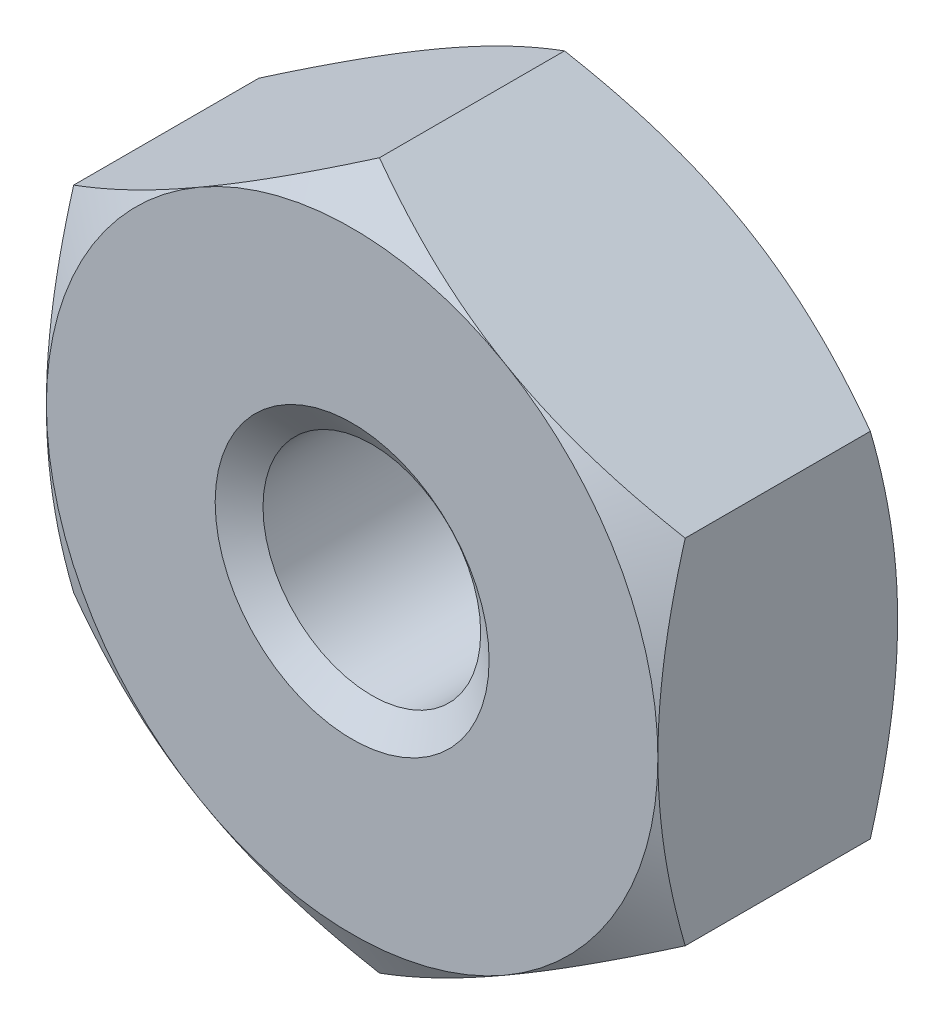
ISO-10303-21;
HEADER;
FILE_DESCRIPTION(('STEP AP214'),'2;1');
FILE_NAME('part.step','',(''),(''),'','','');
FILE_SCHEMA(('AUTOMOTIVE_DESIGN { 1 0 10303 214 1 1 1 1 }'));
ENDSEC;
DATA;
#1=APPLICATION_CONTEXT('core data for automotive mechanical design processes');
#2=APPLICATION_PROTOCOL_DEFINITION('international standard','automotive_design',2000,#1);
#3=PRODUCT_CONTEXT('',#1,'mechanical');
#4=PRODUCT('Part','Part','',(#3));
#5=PRODUCT_RELATED_PRODUCT_CATEGORY('part','',(#4));
#6=PRODUCT_DEFINITION_FORMATION('','',#4);
#7=PRODUCT_DEFINITION_CONTEXT('part definition',#1,'design');
#8=PRODUCT_DEFINITION('design','',#6,#7);
#9=PRODUCT_DEFINITION_SHAPE('','',#8);
#10=(LENGTH_UNIT() NAMED_UNIT(*) SI_UNIT(.MILLI.,.METRE.));
#11=(NAMED_UNIT(*) PLANE_ANGLE_UNIT() SI_UNIT($,.RADIAN.));
#12=(NAMED_UNIT(*) SI_UNIT($,.STERADIAN.) SOLID_ANGLE_UNIT());
#13=UNCERTAINTY_MEASURE_WITH_UNIT(LENGTH_MEASURE(1.E-05),#10,'distance_accuracy_value','');
#14=(GEOMETRIC_REPRESENTATION_CONTEXT(3) GLOBAL_UNCERTAINTY_ASSIGNED_CONTEXT((#13)) GLOBAL_UNIT_ASSIGNED_CONTEXT((#10,
#11,#12)) REPRESENTATION_CONTEXT('',''));
#15=CARTESIAN_POINT('',(0.,0.,0.));
#16=DIRECTION('',(0.,0.,1.));
#17=DIRECTION('',(1.,0.,0.));
#18=AXIS2_PLACEMENT_3D('',#15,#16,#17);
#19=CARTESIAN_POINT('',(0.,0.,-2.4892));
#20=DIRECTION('',(0.,0.,1.));
#21=DIRECTION('',(1.,0.,0.));
#22=AXIS2_PLACEMENT_3D('',#19,#20,#21);
#23=CYLINDRICAL_SURFACE('',#22,1.1303);
#24=CARTESIAN_POINT('',(0.,0.,-0.204530621911055));
#25=DIRECTION('',(0.,0.,1.));
#26=DIRECTION('',(1.,0.,0.));
#27=AXIS2_PLACEMENT_3D('',#24,#25,#26);
#28=CIRCLE('',#27,1.1303);
#29=CARTESIAN_POINT('',(1.1303,0.,-0.204530621911055));
#30=VERTEX_POINT('',#29);
#31=EDGE_CURVE('E176',#30,#30,#28,.F.);
#32=ORIENTED_EDGE('',*,*,#31,.F.);
#33=EDGE_LOOP('',(#32));
#34=FACE_BOUND('',#33,.T.);
#35=CARTESIAN_POINT('',(0.,0.,-2.25926937808894));
#36=DIRECTION('',(0.,0.,-1.));
#37=DIRECTION('',(-1.,0.,0.));
#38=AXIS2_PLACEMENT_3D('',#35,#36,#37);
#39=CIRCLE('',#38,1.1303);
#40=CARTESIAN_POINT('',(-1.1303,0.,-2.25926937808894));
#41=VERTEX_POINT('',#40);
#42=EDGE_CURVE('E41',#41,#41,#39,.F.);
#43=ORIENTED_EDGE('',*,*,#42,.F.);
#44=EDGE_LOOP('',(#43));
#45=FACE_BOUND('',#44,.T.);
#46=ADVANCED_FACE('F36',(#34,#45),#23,.F.);
#47=CARTESIAN_POINT('',(0.,3.66617420935413,-2.4892));
#48=DIRECTION('',(0.,0.,-1.));
#49=DIRECTION('',(-1.,0.,0.));
#50=AXIS2_PLACEMENT_3D('',#47,#48,#49);
#51=PLANE('',#50);
#52=CARTESIAN_POINT('',(0.,0.,-2.4892));
#53=DIRECTION('',(0.,0.,-1.));
#54=DIRECTION('',(-1.,0.,0.));
#55=AXIS2_PLACEMENT_3D('',#52,#53,#54);
#56=CIRCLE('',#55,3.175);
#57=CARTESIAN_POINT('',(-3.175,0.,-2.4892));
#58=VERTEX_POINT('',#57);
#59=CARTESIAN_POINT('',(-1.5875,-2.74963065701559,-2.4892));
#60=VERTEX_POINT('',#59);
#61=EDGE_CURVE('E172',#58,#60,#56,.F.);
#62=ORIENTED_EDGE('',*,*,#61,.F.);
#63=CARTESIAN_POINT('',(-1.58750000000001,2.74963065701559,-2.4892));
#64=VERTEX_POINT('',#63);
#65=EDGE_CURVE('E154',#64,#58,#56,.F.);
#66=ORIENTED_EDGE('',*,*,#65,.F.);
#67=CARTESIAN_POINT('',(1.5875,2.74963065701559,-2.4892));
#68=VERTEX_POINT('',#67);
#69=EDGE_CURVE('E171',#68,#64,#56,.F.);
#70=ORIENTED_EDGE('',*,*,#69,.F.);
#71=CARTESIAN_POINT('',(0.,0.,-2.4892));
#72=DIRECTION('',(0.,0.,1.));
#73=DIRECTION('',(1.,0.,0.));
#74=AXIS2_PLACEMENT_3D('',#71,#72,#73);
#75=CIRCLE('',#74,3.175);
#76=CARTESIAN_POINT('',(3.175,0.,-2.4892));
#77=VERTEX_POINT('',#76);
#78=EDGE_CURVE('E246',#77,#68,#75,.T.);
#79=ORIENTED_EDGE('',*,*,#78,.F.);
#80=CARTESIAN_POINT('',(1.58750000000001,-2.74963065701559,-2.4892));
#81=VERTEX_POINT('',#80);
#82=EDGE_CURVE('E378',#81,#77,#56,.F.);
#83=ORIENTED_EDGE('',*,*,#82,.F.);
#84=EDGE_CURVE('E399',#60,#81,#56,.F.);
#85=ORIENTED_EDGE('',*,*,#84,.F.);
#86=EDGE_LOOP('',(#62,#66,#70,#79,#83,#85));
#87=FACE_BOUND('',#86,.T.);
#88=CARTESIAN_POINT('',(0.,0.,-2.4892));
#89=DIRECTION('',(0.,0.,-1.));
#90=DIRECTION('',(-1.,0.,0.));
#91=AXIS2_PLACEMENT_3D('',#88,#89,#90);
#92=CIRCLE('',#91,1.4224);
#93=CARTESIAN_POINT('',(-1.4224,0.,-2.4892));
#94=VERTEX_POINT('',#93);
#95=EDGE_CURVE('E179',#94,#94,#92,.F.);
#96=ORIENTED_EDGE('',*,*,#95,.T.);
#97=EDGE_LOOP('',(#96));
#98=FACE_BOUND('',#97,.T.);
#99=ADVANCED_FACE('F251',(#87,#98),#51,.T.);
#100=CARTESIAN_POINT('',(0.,3.66617420935413,0.));
#101=DIRECTION('',(0.,0.,-1.));
#102=DIRECTION('',(-1.,0.,0.));
#103=AXIS2_PLACEMENT_3D('',#100,#101,#102);
#104=PLANE('',#103);
#105=CARTESIAN_POINT('',(0.,0.,0.));
#106=DIRECTION('',(0.,0.,-1.));
#107=DIRECTION('',(-1.,0.,0.));
#108=AXIS2_PLACEMENT_3D('',#105,#106,#107);
#109=CIRCLE('',#108,3.175);
#110=CARTESIAN_POINT('',(-3.175,0.,0.));
#111=VERTEX_POINT('',#110);
#112=CARTESIAN_POINT('',(-1.58750000000001,2.74963065701559,0.));
#113=VERTEX_POINT('',#112);
#114=EDGE_CURVE('E11',#111,#113,#109,.T.);
#115=ORIENTED_EDGE('',*,*,#114,.F.);
#116=CARTESIAN_POINT('',(-1.5875,-2.74963065701559,0.));
#117=VERTEX_POINT('',#116);
#118=EDGE_CURVE('E48',#117,#111,#109,.T.);
#119=ORIENTED_EDGE('',*,*,#118,.F.);
#120=CARTESIAN_POINT('',(1.58750000000001,-2.74963065701559,0.));
#121=VERTEX_POINT('',#120);
#122=EDGE_CURVE('E175',#121,#117,#109,.T.);
#123=ORIENTED_EDGE('',*,*,#122,.F.);
#124=CARTESIAN_POINT('',(3.175,0.,0.));
#125=VERTEX_POINT('',#124);
#126=EDGE_CURVE('E344',#125,#121,#109,.T.);
#127=ORIENTED_EDGE('',*,*,#126,.F.);
#128=CARTESIAN_POINT('',(0.,0.,0.));
#129=DIRECTION('',(0.,0.,1.));
#130=DIRECTION('',(1.,0.,0.));
#131=AXIS2_PLACEMENT_3D('',#128,#129,#130);
#132=CIRCLE('',#131,3.175);
#133=CARTESIAN_POINT('',(1.5875,2.74963065701559,0.));
#134=VERTEX_POINT('',#133);
#135=EDGE_CURVE('E130',#125,#134,#132,.T.);
#136=ORIENTED_EDGE('',*,*,#135,.T.);
#137=EDGE_CURVE('E46',#113,#134,#109,.T.);
#138=ORIENTED_EDGE('',*,*,#137,.F.);
#139=EDGE_LOOP('',(#115,#119,#123,#127,#136,#138));
#140=FACE_BOUND('',#139,.T.);
#141=CARTESIAN_POINT('',(0.,0.,0.));
#142=DIRECTION('',(0.,0.,1.));
#143=DIRECTION('',(1.,0.,0.));
#144=AXIS2_PLACEMENT_3D('',#141,#142,#143);
#145=CIRCLE('',#144,1.4224);
#146=CARTESIAN_POINT('',(1.4224,0.,0.));
#147=VERTEX_POINT('',#146);
#148=EDGE_CURVE('E178',#147,#147,#145,.T.);
#149=ORIENTED_EDGE('',*,*,#148,.F.);
#150=EDGE_LOOP('',(#149));
#151=FACE_BOUND('',#150,.T.);
#152=ADVANCED_FACE('F303',(#140,#151),#104,.F.);
#153=CARTESIAN_POINT('',(0.,3.66617420935413,-2.4892));
#154=DIRECTION('',(-0.500000000000003,0.866025403784437,0.));
#155=DIRECTION('',(-0.866025403784437,-0.500000000000003,0.));
#156=AXIS2_PLACEMENT_3D('',#153,#154,#155);
#157=PLANE('',#156);
#158=DIRECTION('',(0.,0.,1.));
#159=VECTOR('',#158,1.);
#160=CARTESIAN_POINT('',(-3.175,1.83308710467705,-2.4892));
#161=LINE('',#160,#159);
#162=CARTESIAN_POINT('',(-3.175,1.83308710467707,-2.20562043801039));
#163=VERTEX_POINT('',#162);
#164=CARTESIAN_POINT('',(-3.175,1.83308710467705,-0.283579561989604));
#165=VERTEX_POINT('',#164);
#166=EDGE_CURVE('E166',#163,#165,#161,.T.);
#167=ORIENTED_EDGE('',*,*,#166,.T.);
#168=CARTESIAN_POINT('',(-3.1752,1.83297163462322,-0.283646231805777));
#169=CARTESIAN_POINT('',(-3.03567460326018,1.91352665998974,-0.237119934023206));
#170=CARTESIAN_POINT('',(-2.89494483272887,1.99477703088899,-0.194805864908322));
#171=CARTESIAN_POINT('',(-2.61104837470026,2.15868472735379,-0.120946008708286));
#172=CARTESIAN_POINT('',(-2.46787664251628,2.24134496547055,-0.0894263509090417));
#173=CARTESIAN_POINT('',(-2.18330753500984,2.40564101629245,-0.0403611049832706));
#174=CARTESIAN_POINT('',(-2.0419539457708,2.48725154909053,-0.0224889669031259));
#175=CARTESIAN_POINT('',(-1.7585816022433,2.65085664790703,-0.00115281403229668));
#176=CARTESIAN_POINT('',(-1.61656387803407,2.73285061920892,0.00232886836810178));
#177=CARTESIAN_POINT('',(-1.35119263453263,2.88606277807967,-0.0049117007222132));
#178=CARTESIAN_POINT('',(-1.22779940341379,2.95730389328231,-0.0138561461436312));
#179=CARTESIAN_POINT('',(-0.981816852669884,3.09932198517026,-0.0422055763684448));
#180=CARTESIAN_POINT('',(-0.859228383940738,3.17009847059057,-0.0616202467099072));
#181=CARTESIAN_POINT('',(-0.612738605574498,3.31240941048281,-0.110155730811224));
#182=CARTESIAN_POINT('',(-0.488868495421443,3.38392585192423,-0.139482298472807));
#183=CARTESIAN_POINT('',(-0.242975839646996,3.52589204292736,-0.206042193662161));
#184=CARTESIAN_POINT('',(-0.120950143425915,3.59634361148865,-0.243259880449917));
#185=CARTESIAN_POINT('',(0.000199999999997795,3.66628967940797,-0.283646231805782));
#186=B_SPLINE_CURVE_WITH_KNOTS('',3,(#168,#169,#170,#171,#172,#173,#174,#175,#176,#177,#178,
#179,#180,#181,#182,#183,#184,#185),.UNSPECIFIED.,.F.,.F.,(4,2,2,2,2,2,2,2,4),(0.,
0.503278731073368,1.00776724301492,1.49976968502821,1.99116790059651,2.41904879402149,
2.84732618162394,3.28510386250598,3.72202181665389),.UNSPECIFIED.);
#187=EDGE_CURVE('E135',#165,#113,#186,.T.);
#188=ORIENTED_EDGE('',*,*,#187,.T.);
#189=CARTESIAN_POINT('',(0.,3.66617420935413,-0.283579561989608));
#190=VERTEX_POINT('',#189);
#191=EDGE_CURVE('E55',#113,#190,#186,.T.);
#192=ORIENTED_EDGE('',*,*,#191,.T.);
#193=DIRECTION('',(0.,0.,1.));
#194=VECTOR('',#193,1.);
#195=CARTESIAN_POINT('',(0.,3.66617420935413,-2.4892));
#196=LINE('',#195,#194);
#197=CARTESIAN_POINT('',(0.,3.66617420935413,-2.20562043801039));
#198=VERTEX_POINT('',#197);
#199=EDGE_CURVE('E151',#198,#190,#196,.T.);
#200=ORIENTED_EDGE('',*,*,#199,.F.);
#201=CARTESIAN_POINT('',(-3.1752,1.83297163462322,-2.20555376819422));
#202=CARTESIAN_POINT('',(-3.03567460326018,1.91352665998974,-2.25208006597679));
#203=CARTESIAN_POINT('',(-2.89494483272887,1.99477703088899,-2.29439413509168));
#204=CARTESIAN_POINT('',(-2.61104837470026,2.15868472735379,-2.36825399129171));
#205=CARTESIAN_POINT('',(-2.46787664251628,2.24134496547055,-2.39977364909096));
#206=CARTESIAN_POINT('',(-2.18330753500984,2.40564101629245,-2.44883889501673));
#207=CARTESIAN_POINT('',(-2.0419539457708,2.48725154909053,-2.46671103309687));
#208=CARTESIAN_POINT('',(-1.7585816022433,2.65085664790703,-2.4880471859677));
#209=CARTESIAN_POINT('',(-1.61656387803408,2.73285061920892,-2.4915288683681));
#210=CARTESIAN_POINT('',(-1.35119263453263,2.88606277807967,-2.48428829927779));
#211=CARTESIAN_POINT('',(-1.22779940341379,2.95730389328231,-2.47534385385637));
#212=CARTESIAN_POINT('',(-0.981816852669885,3.09932198517026,-2.44699442363156));
#213=CARTESIAN_POINT('',(-0.859228383940739,3.17009847059057,-2.42757975329009));
#214=CARTESIAN_POINT('',(-0.612738605574499,3.31240941048281,-2.37904426918878));
#215=CARTESIAN_POINT('',(-0.488868495421443,3.38392585192423,-2.34971770152719));
#216=CARTESIAN_POINT('',(-0.242975839646997,3.52589204292736,-2.28315780633784));
#217=CARTESIAN_POINT('',(-0.120950143425915,3.59634361148865,-2.24594011955008));
#218=CARTESIAN_POINT('',(0.000199999999997508,3.66628967940797,-2.20555376819422));
#219=B_SPLINE_CURVE_WITH_KNOTS('',3,(#201,#202,#203,#204,#205,#206,#207,#208,#209,#210,#211,
#212,#213,#214,#215,#216,#217,#218),.UNSPECIFIED.,.F.,.F.,(4,2,2,2,2,2,2,2,4),(0.,
0.503278731073368,1.00776724301492,1.49976968502821,1.99116790059651,2.41904879402149,
2.84732618162394,3.28510386250597,3.72202181665389),.UNSPECIFIED.);
#220=EDGE_CURVE('E169',#64,#198,#219,.T.);
#221=ORIENTED_EDGE('',*,*,#220,.F.);
#222=EDGE_CURVE('E261',#163,#64,#219,.T.);
#223=ORIENTED_EDGE('',*,*,#222,.F.);
#224=EDGE_LOOP('',(#167,#188,#192,#200,#221,#223));
#225=FACE_BOUND('',#224,.T.);
#226=ADVANCED_FACE('F38',(#225),#157,.T.);
#227=CARTESIAN_POINT('',(3.175,1.83308710467706,-2.4892));
#228=DIRECTION('',(0.500000000000001,0.866025403784438,0.));
#229=DIRECTION('',(-0.866025403784438,0.500000000000001,0.));
#230=AXIS2_PLACEMENT_3D('',#227,#228,#229);
#231=PLANE('',#230);
#232=ORIENTED_EDGE('',*,*,#199,.T.);
#233=CARTESIAN_POINT('',(-0.000200000000002592,3.66628967940797,-0.283646231805782));
#234=CARTESIAN_POINT('',(0.139325396739816,3.58573465404144,-0.237119934023211));
#235=CARTESIAN_POINT('',(0.280055167271126,3.5044842831422,-0.194805864908326));
#236=CARTESIAN_POINT('',(0.56395162529974,3.34057658667739,-0.120946008708289));
#237=CARTESIAN_POINT('',(0.707123357483716,3.25791634856063,-0.0894263509090447));
#238=CARTESIAN_POINT('',(0.991692464990165,3.09362029773873,-0.0403611049832727));
#239=CARTESIAN_POINT('',(1.1330460542292,3.01200976494065,-0.0224889669031276));
#240=CARTESIAN_POINT('',(1.41641839775671,2.84840466612415,-0.00115281403229755));
#241=CARTESIAN_POINT('',(1.55843612196593,2.76641069482226,0.00232886836810127));
#242=CARTESIAN_POINT('',(1.82380736546737,2.61319853595151,-0.00491170072221298));
#243=CARTESIAN_POINT('',(1.94720059658621,2.54195742074887,-0.0138561461436305));
#244=CARTESIAN_POINT('',(2.19318314733012,2.39993932886093,-0.0422055763684434));
#245=CARTESIAN_POINT('',(2.31577161605926,2.32916284344061,-0.0616202467099056));
#246=CARTESIAN_POINT('',(2.5622613944255,2.18685190354837,-0.110155730811222));
#247=CARTESIAN_POINT('',(2.68613150457856,2.11533546210696,-0.139482298472804));
#248=CARTESIAN_POINT('',(2.932024160353,1.97336927110383,-0.206042193662157));
#249=CARTESIAN_POINT('',(3.05404985657409,1.90291770254253,-0.243259880449913));
#250=CARTESIAN_POINT('',(3.1752,1.83297163462322,-0.283646231805778));
#251=B_SPLINE_CURVE_WITH_KNOTS('',3,(#233,#234,#235,#236,#237,#238,#239,#240,#241,#242,#243,
#244,#245,#246,#247,#248,#249,#250),.UNSPECIFIED.,.F.,.F.,(4,2,2,2,2,2,2,2,4),(0.,
0.503278731073369,1.00776724301492,1.49976968502821,1.99116790059651,2.41904879402149,
2.84732618162394,3.28510386250598,3.72202181665389),.UNSPECIFIED.);
#252=EDGE_CURVE('E145',#190,#134,#251,.T.);
#253=ORIENTED_EDGE('',*,*,#252,.T.);
#254=CARTESIAN_POINT('',(3.175,1.83308710467707,-0.283579561989608));
#255=VERTEX_POINT('',#254);
#256=EDGE_CURVE('E62',#134,#255,#251,.T.);
#257=ORIENTED_EDGE('',*,*,#256,.T.);
#258=DIRECTION('',(0.,0.,1.));
#259=VECTOR('',#258,1.);
#260=CARTESIAN_POINT('',(3.175,1.83308710467706,-2.4892));
#261=LINE('',#260,#259);
#262=CARTESIAN_POINT('',(3.175,1.83308710467707,-2.20562043801039));
#263=VERTEX_POINT('',#262);
#264=EDGE_CURVE('E144',#263,#255,#261,.T.);
#265=ORIENTED_EDGE('',*,*,#264,.F.);
#266=CARTESIAN_POINT('',(-0.000200000000002578,3.66628967940797,-2.20555376819422));
#267=CARTESIAN_POINT('',(0.139325396739816,3.58573465404144,-2.25208006597679));
#268=CARTESIAN_POINT('',(0.280055167271126,3.5044842831422,-2.29439413509167));
#269=CARTESIAN_POINT('',(0.56395162529974,3.34057658667739,-2.36825399129171));
#270=CARTESIAN_POINT('',(0.707123357483716,3.25791634856063,-2.39977364909096));
#271=CARTESIAN_POINT('',(0.991692464990165,3.09362029773873,-2.44883889501673));
#272=CARTESIAN_POINT('',(1.1330460542292,3.01200976494066,-2.46671103309687));
#273=CARTESIAN_POINT('',(1.4164183977567,2.84840466612415,-2.4880471859677));
#274=CARTESIAN_POINT('',(1.55843612196593,2.76641069482226,-2.4915288683681));
#275=CARTESIAN_POINT('',(1.82380736546737,2.61319853595151,-2.48428829927779));
#276=CARTESIAN_POINT('',(1.94720059658621,2.54195742074887,-2.47534385385637));
#277=CARTESIAN_POINT('',(2.19318314733012,2.39993932886093,-2.44699442363156));
#278=CARTESIAN_POINT('',(2.31577161605926,2.32916284344061,-2.42757975329009));
#279=CARTESIAN_POINT('',(2.5622613944255,2.18685190354837,-2.37904426918878));
#280=CARTESIAN_POINT('',(2.68613150457856,2.11533546210696,-2.3497177015272));
#281=CARTESIAN_POINT('',(2.932024160353,1.97336927110383,-2.28315780633784));
#282=CARTESIAN_POINT('',(3.05404985657409,1.90291770254253,-2.24594011955009));
#283=CARTESIAN_POINT('',(3.1752,1.83297163462322,-2.20555376819422));
#284=B_SPLINE_CURVE_WITH_KNOTS('',3,(#266,#267,#268,#269,#270,#271,#272,#273,#274,#275,#276,
#277,#278,#279,#280,#281,#282,#283),.UNSPECIFIED.,.F.,.F.,(4,2,2,2,2,2,2,2,4),(0.,
0.503278731073369,1.00776724301492,1.49976968502821,1.99116790059651,2.41904879402149,
2.84732618162394,3.28510386250597,3.72202181665389),.UNSPECIFIED.);
#285=EDGE_CURVE('E255',#68,#263,#284,.T.);
#286=ORIENTED_EDGE('',*,*,#285,.F.);
#287=EDGE_CURVE('E260',#198,#68,#284,.T.);
#288=ORIENTED_EDGE('',*,*,#287,.F.);
#289=EDGE_LOOP('',(#232,#253,#257,#265,#286,#288));
#290=FACE_BOUND('',#289,.T.);
#291=ADVANCED_FACE('F142',(#290),#231,.T.);
#292=CARTESIAN_POINT('',(3.175,1.83308710467706,-2.4892));
#293=DIRECTION('',(-1.,0.,0.));
#294=DIRECTION('',(0.,0.,1.));
#295=AXIS2_PLACEMENT_3D('',#292,#293,#294);
#296=PLANE('',#295);
#297=CARTESIAN_POINT('',(3.175,-4.8616171420299,-1.51932228935976));
#298=CARTESIAN_POINT('',(3.175,-4.72221668774449,-1.45195628992123));
#299=CARTESIAN_POINT('',(3.175,-4.58248664475634,-1.38525996427212));
#300=CARTESIAN_POINT('',(3.175,-4.30218917292502,-1.25358933527025));
#301=CARTESIAN_POINT('',(3.175,-4.16162160419068,-1.18861533006649));
#302=CARTESIAN_POINT('',(3.175,-3.87871153776028,-1.06042973005273));
#303=CARTESIAN_POINT('',(3.175,-3.73636348618431,-0.997230348581289));
#304=CARTESIAN_POINT('',(3.175,-3.4504974070564,-0.873546152177363));
#305=CARTESIAN_POINT('',(3.175,-3.30697944095183,-0.813061195746994));
#306=CARTESIAN_POINT('',(3.175,-3.01676360978826,-0.694809578750527));
#307=CARTESIAN_POINT('',(3.175,-2.87004833678074,-0.637085406846329));
#308=CARTESIAN_POINT('',(3.175,-2.57488727143506,-0.52615800832404));
#309=CARTESIAN_POINT('',(3.175,-2.42644128864792,-0.472955284693414));
#310=CARTESIAN_POINT('',(3.175,-2.12788752613931,-0.372500325317013));
#311=CARTESIAN_POINT('',(3.175,-1.97778404697074,-0.325235438859671));
#312=CARTESIAN_POINT('',(3.175,-1.67544317117207,-0.238191164257202));
#313=CARTESIAN_POINT('',(3.175,-1.52320646578688,-0.198409408930922));
#314=CARTESIAN_POINT('',(3.175,-1.21649515954196,-0.12826269349477));
#315=CARTESIAN_POINT('',(3.175,-1.06201997425122,-0.0979002407280034));
#316=CARTESIAN_POINT('',(3.175,-0.751207163661342,-0.0486364247633595));
#317=CARTESIAN_POINT('',(3.175,-0.594869536715698,-0.0297350716985354));
#318=CARTESIAN_POINT('',(3.175,-0.282140016767182,-0.00506556418736419));
#319=CARTESIAN_POINT('',(3.175,-0.125754853180874,0.000785733729077507));
#320=CARTESIAN_POINT('',(3.175,0.186905967950925,-0.000955727684993067));
#321=CARTESIAN_POINT('',(3.175,0.34318164338531,-0.00854499720968375));
#322=CARTESIAN_POINT('',(3.175,0.61004500421025,-0.0324474955995366));
#323=CARTESIAN_POINT('',(3.175,0.720927103340566,-0.0456480037348523));
#324=CARTESIAN_POINT('',(3.175,0.941834770691505,-0.0779568944626853));
#325=CARTESIAN_POINT('',(3.175,1.05186020102054,-0.0970662087901405));
#326=CARTESIAN_POINT('',(3.175,1.38056179828294,-0.162254462566744));
#327=CARTESIAN_POINT('',(3.175,1.59769723107173,-0.216176928599964));
#328=CARTESIAN_POINT('',(3.175,1.92260738330278,-0.309178610208029));
#329=CARTESIAN_POINT('',(3.175,2.03207569486971,-0.342672941312984));
#330=CARTESIAN_POINT('',(3.175,2.24986976286739,-0.412975885555784));
#331=CARTESIAN_POINT('',(3.175,2.35819625057448,-0.44978221272336));
#332=CARTESIAN_POINT('',(3.175,2.57325368409845,-0.52594327372435));
#333=CARTESIAN_POINT('',(3.175,2.67999017870302,-0.565282497316839));
#334=CARTESIAN_POINT('',(3.175,2.89263503540125,-0.646269943321368));
#335=CARTESIAN_POINT('',(3.175,2.99854304277513,-0.687919098952172));
#336=CARTESIAN_POINT('',(3.175,3.1040681107068,-0.730495273942545));
#337=B_SPLINE_CURVE_WITH_KNOTS('',3,(#297,#298,#299,#300,#301,#302,#303,#304,#305,#306,#307,
#308,#309,#310,#311,#312,#313,#314,#315,#316,#317,#318,#319,#320,#321,#322,#323,#324,#325,#326,
#327,#328,#329,#330,#331,#332,#333,#334,#335,#336),.UNSPECIFIED.,.F.,.F.,(4,2,2,2,2,2,2,2,2,2,2,
2,2,2,2,2,2,2,2,4),(0.,0.46448011032249,0.929040108038168,1.39625859500254,1.86345269838581,
2.33638249541752,2.80936483473484,3.2813217385372,3.7531290935448,4.22506193235102,
4.69699518840458,5.16591300646641,5.63470908917535,5.96954086780257,6.30442547160104,
6.97469308766864,7.3180994250629,7.66127053211061,8.00251004161232,8.34388843151021),.UNSPECIFIED.);
#338=CARTESIAN_POINT('',(3.175,-1.83308710467707,-0.283579561989608));
#339=VERTEX_POINT('',#338);
#340=EDGE_CURVE('E137',#339,#125,#337,.T.);
#341=ORIENTED_EDGE('',*,*,#340,.F.);
#342=DIRECTION('',(0.,0.,1.));
#343=VECTOR('',#342,1.);
#344=CARTESIAN_POINT('',(3.175,-1.83308710467707,-2.4892));
#345=LINE('',#344,#343);
#346=CARTESIAN_POINT('',(3.175,-1.83308710467707,-2.20562043801039));
#347=VERTEX_POINT('',#346);
#348=EDGE_CURVE('E152',#347,#339,#345,.T.);
#349=ORIENTED_EDGE('',*,*,#348,.F.);
#350=CARTESIAN_POINT('',(3.175,-4.86161714202989,-0.969877710640244));
#351=CARTESIAN_POINT('',(3.175,-4.72221668774449,-1.03724371007878));
#352=CARTESIAN_POINT('',(3.175,-4.58248664475633,-1.10394003572788));
#353=CARTESIAN_POINT('',(3.175,-4.30218917292502,-1.23561066472975));
#354=CARTESIAN_POINT('',(3.175,-4.16162160419068,-1.30058466993351));
#355=CARTESIAN_POINT('',(3.175,-3.87871153776028,-1.42877026994727));
#356=CARTESIAN_POINT('',(3.175,-3.73636348618431,-1.49196965141871));
#357=CARTESIAN_POINT('',(3.175,-3.4504974070564,-1.61565384782264));
#358=CARTESIAN_POINT('',(3.175,-3.30697944095183,-1.67613880425301));
#359=CARTESIAN_POINT('',(3.175,-3.01676360978826,-1.79439042124948));
#360=CARTESIAN_POINT('',(3.175,-2.87004833678074,-1.85211459315367));
#361=CARTESIAN_POINT('',(3.175,-2.57488727143506,-1.96304199167596));
#362=CARTESIAN_POINT('',(3.175,-2.42644128864792,-2.01624471530659));
#363=CARTESIAN_POINT('',(3.175,-2.12788752613931,-2.11669967468299));
#364=CARTESIAN_POINT('',(3.175,-1.97778404697074,-2.16396456114033));
#365=CARTESIAN_POINT('',(3.175,-1.67544317117207,-2.2510088357428));
#366=CARTESIAN_POINT('',(3.175,-1.52320646578688,-2.29079059106908));
#367=CARTESIAN_POINT('',(3.175,-1.21649515954197,-2.36093730650523));
#368=CARTESIAN_POINT('',(3.175,-1.06201997425122,-2.391299759272));
#369=CARTESIAN_POINT('',(3.175,-0.751207163661344,-2.44056357523664));
#370=CARTESIAN_POINT('',(3.175,-0.5948695367157,-2.45946492830147));
#371=CARTESIAN_POINT('',(3.175,-0.282140016767183,-2.48413443581264));
#372=CARTESIAN_POINT('',(3.175,-0.125754853180875,-2.48998573372908));
#373=CARTESIAN_POINT('',(3.175,0.186905967950924,-2.48824427231501));
#374=CARTESIAN_POINT('',(3.175,0.343181643385309,-2.48065500279032));
#375=CARTESIAN_POINT('',(3.175,0.61004500421025,-2.45675250440046));
#376=CARTESIAN_POINT('',(3.175,0.720927103340565,-2.44355199626515));
#377=CARTESIAN_POINT('',(3.175,0.941834770691505,-2.41124310553732));
#378=CARTESIAN_POINT('',(3.175,1.05186020102054,-2.39213379120986));
#379=CARTESIAN_POINT('',(3.175,1.38056179828294,-2.32694553743326));
#380=CARTESIAN_POINT('',(3.175,1.59769723107173,-2.27302307140004));
#381=CARTESIAN_POINT('',(3.175,1.92260738330278,-2.18002138979197));
#382=CARTESIAN_POINT('',(3.175,2.03207569486971,-2.14652705868702));
#383=CARTESIAN_POINT('',(3.175,2.24986976286739,-2.07622411444422));
#384=CARTESIAN_POINT('',(3.175,2.35819625057448,-2.03941778727664));
#385=CARTESIAN_POINT('',(3.175,2.57325368409845,-1.96325672627565));
#386=CARTESIAN_POINT('',(3.175,2.67999017870302,-1.92391750268316));
#387=CARTESIAN_POINT('',(3.175,2.89263503540125,-1.84293005667863));
#388=CARTESIAN_POINT('',(3.175,2.99854304277513,-1.80128090104783));
#389=CARTESIAN_POINT('',(3.175,3.1040681107068,-1.75870472605745));
#390=B_SPLINE_CURVE_WITH_KNOTS('',3,(#350,#351,#352,#353,#354,#355,#356,#357,#358,#359,#360,
#361,#362,#363,#364,#365,#366,#367,#368,#369,#370,#371,#372,#373,#374,#375,#376,#377,#378,#379,
#380,#381,#382,#383,#384,#385,#386,#387,#388,#389),.UNSPECIFIED.,.F.,.F.,(4,2,2,2,2,2,2,2,2,2,2,
2,2,2,2,2,2,2,2,4),(0.,0.464480110322489,0.929040108038167,1.39625859500254,1.86345269838581,
2.33638249541752,2.80936483473484,3.2813217385372,3.7531290935448,4.22506193235102,
4.69699518840457,5.16591300646641,5.63470908917534,5.96954086780257,6.30442547160103,
6.97469308766864,7.3180994250629,7.66127053211061,8.00251004161232,8.34388843151022),.UNSPECIFIED.);
#391=EDGE_CURVE('E267',#347,#77,#390,.T.);
#392=ORIENTED_EDGE('',*,*,#391,.T.);
#393=EDGE_CURVE('E150',#77,#263,#390,.T.);
#394=ORIENTED_EDGE('',*,*,#393,.T.);
#395=ORIENTED_EDGE('',*,*,#264,.T.);
#396=EDGE_CURVE('E127',#125,#255,#337,.T.);
#397=ORIENTED_EDGE('',*,*,#396,.F.);
#398=EDGE_LOOP('',(#341,#349,#392,#394,#395,#397));
#399=FACE_BOUND('',#398,.T.);
#400=ADVANCED_FACE('F148',(#399),#296,.F.);
#401=CARTESIAN_POINT('',(0.,-3.66617420935414,-2.4892));
#402=DIRECTION('',(0.500000000000003,-0.866025403784437,0.));
#403=DIRECTION('',(0.866025403784437,0.500000000000003,0.));
#404=AXIS2_PLACEMENT_3D('',#401,#402,#403);
#405=PLANE('',#404);
#406=ORIENTED_EDGE('',*,*,#348,.T.);
#407=CARTESIAN_POINT('',(3.1752,-1.83297163462323,-0.283646231805781));
#408=CARTESIAN_POINT('',(3.03567460326018,-1.91352665998975,-0.23711993402321));
#409=CARTESIAN_POINT('',(2.89494483272887,-1.994777030889,-0.194805864908325));
#410=CARTESIAN_POINT('',(2.61104837470026,-2.1586847273538,-0.12094600870829));
#411=CARTESIAN_POINT('',(2.46787664251628,-2.24134496547057,-0.089426350909046));
#412=CARTESIAN_POINT('',(2.18330753500983,-2.40564101629247,-0.0403611049832756));
#413=CARTESIAN_POINT('',(2.0419539457708,-2.48725154909054,-0.0224889669031313));
#414=CARTESIAN_POINT('',(1.75858160224329,-2.65085664790705,-0.00115281403230271));
#415=CARTESIAN_POINT('',(1.61656387803407,-2.73285061920894,0.00232886836809552));
#416=CARTESIAN_POINT('',(1.35119263453262,-2.88606277807969,-0.00491170072221993));
#417=CARTESIAN_POINT('',(1.22779940341379,-2.95730389328232,-0.0138561461436381));
#418=CARTESIAN_POINT('',(0.981816852669881,-3.09932198517027,-0.0422055763684521));
#419=CARTESIAN_POINT('',(0.859228383940735,-3.17009847059059,-0.0616202467099147));
#420=CARTESIAN_POINT('',(0.612738605574495,-3.31240941048283,-0.110155730811232));
#421=CARTESIAN_POINT('',(0.48886849542144,-3.38392585192424,-0.139482298472814));
#422=CARTESIAN_POINT('',(0.242975839646995,-3.52589204292737,-0.206042193662168));
#423=CARTESIAN_POINT('',(0.120950143425913,-3.59634361148867,-0.243259880449925));
#424=CARTESIAN_POINT('',(-0.000199999999999131,-3.66628967940798,-0.283646231805789));
#425=B_SPLINE_CURVE_WITH_KNOTS('',3,(#407,#408,#409,#410,#411,#412,#413,#414,#415,#416,#417,
#418,#419,#420,#421,#422,#423,#424),.UNSPECIFIED.,.F.,.F.,(4,2,2,2,2,2,2,2,4),(0.,
0.503278731073368,1.00776724301492,1.49976968502821,1.99116790059651,2.41904879402149,
2.84732618162394,3.28510386250597,3.72202181665389),.UNSPECIFIED.);
#426=EDGE_CURVE('E347',#339,#121,#425,.T.);
#427=ORIENTED_EDGE('',*,*,#426,.T.);
#428=CARTESIAN_POINT('',(0.,-3.66617420935413,-0.283579561989608));
#429=VERTEX_POINT('',#428);
#430=EDGE_CURVE('E227',#121,#429,#425,.T.);
#431=ORIENTED_EDGE('',*,*,#430,.T.);
#432=DIRECTION('',(0.,0.,1.));
#433=VECTOR('',#432,1.);
#434=CARTESIAN_POINT('',(0.,-3.66617420935414,-2.4892));
#435=LINE('',#434,#433);
#436=CARTESIAN_POINT('',(0.,-3.66617420935413,-2.20562043801039));
#437=VERTEX_POINT('',#436);
#438=EDGE_CURVE('E157',#437,#429,#435,.T.);
#439=ORIENTED_EDGE('',*,*,#438,.F.);
#440=CARTESIAN_POINT('',(3.1752,-1.83297163462323,-2.20555376819422));
#441=CARTESIAN_POINT('',(3.03567460326018,-1.91352665998975,-2.25208006597679));
#442=CARTESIAN_POINT('',(2.89494483272887,-1.994777030889,-2.29439413509168));
#443=CARTESIAN_POINT('',(2.61104837470026,-2.1586847273538,-2.36825399129171));
#444=CARTESIAN_POINT('',(2.46787664251628,-2.24134496547057,-2.39977364909095));
#445=CARTESIAN_POINT('',(2.18330753500983,-2.40564101629247,-2.44883889501672));
#446=CARTESIAN_POINT('',(2.0419539457708,-2.48725154909054,-2.46671103309687));
#447=CARTESIAN_POINT('',(1.75858160224329,-2.65085664790705,-2.4880471859677));
#448=CARTESIAN_POINT('',(1.61656387803407,-2.73285061920894,-2.4915288683681));
#449=CARTESIAN_POINT('',(1.35119263453262,-2.88606277807969,-2.48428829927778));
#450=CARTESIAN_POINT('',(1.22779940341379,-2.95730389328232,-2.47534385385636));
#451=CARTESIAN_POINT('',(0.981816852669881,-3.09932198517027,-2.44699442363155));
#452=CARTESIAN_POINT('',(0.859228383940735,-3.17009847059059,-2.42757975329009));
#453=CARTESIAN_POINT('',(0.612738605574495,-3.31240941048283,-2.37904426918877));
#454=CARTESIAN_POINT('',(0.48886849542144,-3.38392585192424,-2.34971770152719));
#455=CARTESIAN_POINT('',(0.242975839646994,-3.52589204292737,-2.28315780633783));
#456=CARTESIAN_POINT('',(0.120950143425913,-3.59634361148867,-2.24594011955008));
#457=CARTESIAN_POINT('',(-0.000199999999999717,-3.66628967940798,-2.20555376819421));
#458=B_SPLINE_CURVE_WITH_KNOTS('',3,(#440,#441,#442,#443,#444,#445,#446,#447,#448,#449,#450,
#451,#452,#453,#454,#455,#456,#457),.UNSPECIFIED.,.F.,.F.,(4,2,2,2,2,2,2,2,4),(0.,
0.503278731073368,1.00776724301492,1.49976968502821,1.99116790059651,2.41904879402149,
2.84732618162394,3.28510386250597,3.72202181665389),.UNSPECIFIED.);
#459=EDGE_CURVE('E273',#81,#437,#458,.T.);
#460=ORIENTED_EDGE('',*,*,#459,.F.);
#461=EDGE_CURVE('E272',#347,#81,#458,.T.);
#462=ORIENTED_EDGE('',*,*,#461,.F.);
#463=EDGE_LOOP('',(#406,#427,#431,#439,#460,#462));
#464=FACE_BOUND('',#463,.T.);
#465=ADVANCED_FACE('F283',(#464),#405,.T.);
#466=CARTESIAN_POINT('',(-3.175,-1.83308710467707,-2.4892));
#467=DIRECTION('',(-0.500000000000001,-0.866025403784438,0.));
#468=DIRECTION('',(0.866025403784438,-0.500000000000001,0.));
#469=AXIS2_PLACEMENT_3D('',#466,#467,#468);
#470=PLANE('',#469);
#471=ORIENTED_EDGE('',*,*,#438,.T.);
#472=CARTESIAN_POINT('',(0.000200000000000635,-3.66628967940798,-0.28364623180579));
#473=CARTESIAN_POINT('',(-0.139325396739819,-3.58573465404145,-0.237119934023219));
#474=CARTESIAN_POINT('',(-0.280055167271129,-3.50448428314221,-0.194805864908333));
#475=CARTESIAN_POINT('',(-0.563951625299744,-3.34057658667741,-0.120946008708296));
#476=CARTESIAN_POINT('',(-0.70712335748372,-3.25791634856064,-0.0894263509090518));
#477=CARTESIAN_POINT('',(-0.99169246499017,-3.09362029773874,-0.0403611049832797));
#478=CARTESIAN_POINT('',(-1.1330460542292,-3.01200976494067,-0.0224889669031346));
#479=CARTESIAN_POINT('',(-1.41641839775671,-2.84840466612416,-0.00115281403230467));
#480=CARTESIAN_POINT('',(-1.55843612196593,-2.76641069482227,0.0023288683680941));
#481=CARTESIAN_POINT('',(-1.82380736546738,-2.61319853595152,-0.0049117007222203));
#482=CARTESIAN_POINT('',(-1.94720059658622,-2.54195742074889,-0.0138561461436378));
#483=CARTESIAN_POINT('',(-2.19318314733012,-2.39993932886094,-0.0422055763684505));
#484=CARTESIAN_POINT('',(-2.31577161605927,-2.32916284344062,-0.0616202467099124));
#485=CARTESIAN_POINT('',(-2.56226139442551,-2.18685190354838,-0.110155730811228));
#486=CARTESIAN_POINT('',(-2.68613150457856,-2.11533546210697,-0.13948229847281));
#487=CARTESIAN_POINT('',(-2.93202416035301,-1.97336927110384,-0.206042193662163));
#488=CARTESIAN_POINT('',(-3.05404985657409,-1.90291770254255,-0.243259880449918));
#489=CARTESIAN_POINT('',(-3.1752,-1.83297163462324,-0.283646231805783));
#490=B_SPLINE_CURVE_WITH_KNOTS('',3,(#472,#473,#474,#475,#476,#477,#478,#479,#480,#481,#482,
#483,#484,#485,#486,#487,#488,#489),.UNSPECIFIED.,.F.,.F.,(4,2,2,2,2,2,2,2,4),(0.,
0.503278731073371,1.00776724301493,1.49976968502822,1.99116790059652,2.41904879402149,
2.84732618162395,3.28510386250598,3.72202181665389),.UNSPECIFIED.);
#491=EDGE_CURVE('E350',#429,#117,#490,.T.);
#492=ORIENTED_EDGE('',*,*,#491,.T.);
#493=CARTESIAN_POINT('',(-3.175,-1.83308710467707,-0.283579561989608));
#494=VERTEX_POINT('',#493);
#495=EDGE_CURVE('E201',#117,#494,#490,.T.);
#496=ORIENTED_EDGE('',*,*,#495,.T.);
#497=DIRECTION('',(0.,0.,1.));
#498=VECTOR('',#497,1.);
#499=CARTESIAN_POINT('',(-3.175,-1.83308710467707,-2.4892));
#500=LINE('',#499,#498);
#501=CARTESIAN_POINT('',(-3.175,-1.83308710467707,-2.20562043801039));
#502=VERTEX_POINT('',#501);
#503=EDGE_CURVE('E163',#502,#494,#500,.T.);
#504=ORIENTED_EDGE('',*,*,#503,.F.);
#505=CARTESIAN_POINT('',(0.000200000000000635,-3.66628967940798,-2.20555376819421));
#506=CARTESIAN_POINT('',(-0.139325396739819,-3.58573465404146,-2.25208006597678));
#507=CARTESIAN_POINT('',(-0.280055167271129,-3.50448428314221,-2.29439413509167));
#508=CARTESIAN_POINT('',(-0.563951625299743,-3.34057658667741,-2.3682539912917));
#509=CARTESIAN_POINT('',(-0.70712335748372,-3.25791634856064,-2.39977364909095));
#510=CARTESIAN_POINT('',(-0.99169246499017,-3.09362029773874,-2.44883889501672));
#511=CARTESIAN_POINT('',(-1.1330460542292,-3.01200976494067,-2.46671103309687));
#512=CARTESIAN_POINT('',(-1.41641839775671,-2.84840466612416,-2.4880471859677));
#513=CARTESIAN_POINT('',(-1.55843612196593,-2.76641069482227,-2.49152886836809));
#514=CARTESIAN_POINT('',(-1.82380736546738,-2.61319853595152,-2.48428829927778));
#515=CARTESIAN_POINT('',(-1.94720059658622,-2.54195742074889,-2.47534385385636));
#516=CARTESIAN_POINT('',(-2.19318314733012,-2.39993932886094,-2.44699442363155));
#517=CARTESIAN_POINT('',(-2.31577161605927,-2.32916284344062,-2.42757975329009));
#518=CARTESIAN_POINT('',(-2.56226139442551,-2.18685190354838,-2.37904426918877));
#519=CARTESIAN_POINT('',(-2.68613150457856,-2.11533546210697,-2.34971770152719));
#520=CARTESIAN_POINT('',(-2.93202416035301,-1.97336927110384,-2.28315780633784));
#521=CARTESIAN_POINT('',(-3.05404985657409,-1.90291770254255,-2.24594011955008));
#522=CARTESIAN_POINT('',(-3.1752,-1.83297163462324,-2.20555376819422));
#523=B_SPLINE_CURVE_WITH_KNOTS('',3,(#505,#506,#507,#508,#509,#510,#511,#512,#513,#514,#515,
#516,#517,#518,#519,#520,#521,#522),.UNSPECIFIED.,.F.,.F.,(4,2,2,2,2,2,2,2,4),(0.,
0.50327873107337,1.00776724301493,1.49976968502822,1.99116790059652,2.41904879402149,
2.84732618162394,3.28510386250598,3.72202181665389),.UNSPECIFIED.);
#524=EDGE_CURVE('E279',#60,#502,#523,.T.);
#525=ORIENTED_EDGE('',*,*,#524,.F.);
#526=EDGE_CURVE('E278',#437,#60,#523,.T.);
#527=ORIENTED_EDGE('',*,*,#526,.F.);
#528=EDGE_LOOP('',(#471,#492,#496,#504,#525,#527));
#529=FACE_BOUND('',#528,.T.);
#530=ADVANCED_FACE('F286',(#529),#470,.T.);
#531=CARTESIAN_POINT('',(-3.175,1.83308710467705,-2.4892));
#532=DIRECTION('',(-1.,0.,0.));
#533=DIRECTION('',(0.,0.,1.));
#534=AXIS2_PLACEMENT_3D('',#531,#532,#533);
#535=PLANE('',#534);
#536=ORIENTED_EDGE('',*,*,#503,.T.);
#537=CARTESIAN_POINT('',(-3.175,-4.8616171420299,-1.51932228935977));
#538=CARTESIAN_POINT('',(-3.175,-4.7222166877445,-1.45195628992123));
#539=CARTESIAN_POINT('',(-3.175,-4.58248664475634,-1.38525996427213));
#540=CARTESIAN_POINT('',(-3.175,-4.30218917292502,-1.25358933527026));
#541=CARTESIAN_POINT('',(-3.175,-4.16162160419068,-1.1886153300665));
#542=CARTESIAN_POINT('',(-3.175,-3.87871153776028,-1.06042973005274));
#543=CARTESIAN_POINT('',(-3.175,-3.73636348618432,-0.997230348581292));
#544=CARTESIAN_POINT('',(-3.175,-3.45049740705641,-0.873546152177366));
#545=CARTESIAN_POINT('',(-3.175,-3.30697944095184,-0.813061195746997));
#546=CARTESIAN_POINT('',(-3.175,-3.01676360978827,-0.69480957875053));
#547=CARTESIAN_POINT('',(-3.175,-2.87004833678074,-0.637085406846332));
#548=CARTESIAN_POINT('',(-3.175,-2.57488727143507,-0.526158008324043));
#549=CARTESIAN_POINT('',(-3.175,-2.42644128864793,-0.472955284693417));
#550=CARTESIAN_POINT('',(-3.175,-2.12788752613931,-0.372500325317016));
#551=CARTESIAN_POINT('',(-3.175,-1.97778404697074,-0.325235438859674));
#552=CARTESIAN_POINT('',(-3.175,-1.67544317117207,-0.238191164257204));
#553=CARTESIAN_POINT('',(-3.175,-1.52320646578689,-0.198409408930924));
#554=CARTESIAN_POINT('',(-3.175,-1.21649515954197,-0.128262693494772));
#555=CARTESIAN_POINT('',(-3.175,-1.06201997425123,-0.0979002407280051));
#556=CARTESIAN_POINT('',(-3.175,-0.751207163661346,-0.0486364247633609));
#557=CARTESIAN_POINT('',(-3.175,-0.594869536715702,-0.0297350716985367));
#558=CARTESIAN_POINT('',(-3.175,-0.282140016767186,-0.00506556418736537));
#559=CARTESIAN_POINT('',(-3.175,-0.125754853180878,0.000785733729076388));
#560=CARTESIAN_POINT('',(-3.175,0.186905967950922,-0.000955727684993951));
#561=CARTESIAN_POINT('',(-3.175,0.343181643385307,-0.00854499720968445));
#562=CARTESIAN_POINT('',(-3.175,0.610045004210248,-0.0324474955995374));
#563=CARTESIAN_POINT('',(-3.175,0.720927103340562,-0.0456480037348531));
#564=CARTESIAN_POINT('',(-3.175,0.941834770691502,-0.077956894462686));
#565=CARTESIAN_POINT('',(-3.175,1.05186020102053,-0.097066208790141));
#566=CARTESIAN_POINT('',(-3.175,1.38056179828294,-0.162254462566744));
#567=CARTESIAN_POINT('',(-3.175,1.59769723107172,-0.216176928599964));
#568=CARTESIAN_POINT('',(-3.175,1.92260738330277,-0.309178610208028));
#569=CARTESIAN_POINT('',(-3.175,2.0320756948697,-0.342672941312984));
#570=CARTESIAN_POINT('',(-3.175,2.24986976286738,-0.412975885555784));
#571=CARTESIAN_POINT('',(-3.175,2.35819625057448,-0.44978221272336));
#572=CARTESIAN_POINT('',(-3.175,2.57325368409844,-0.52594327372435));
#573=CARTESIAN_POINT('',(-3.175,2.67999017870302,-0.565282497316838));
#574=CARTESIAN_POINT('',(-3.175,2.89263503540124,-0.646269943321367));
#575=CARTESIAN_POINT('',(-3.175,2.99854304277512,-0.687919098952171));
#576=CARTESIAN_POINT('',(-3.175,3.10406811070679,-0.730495273942545));
#577=B_SPLINE_CURVE_WITH_KNOTS('',3,(#537,#538,#539,#540,#541,#542,#543,#544,#545,#546,#547,
#548,#549,#550,#551,#552,#553,#554,#555,#556,#557,#558,#559,#560,#561,#562,#563,#564,#565,#566,
#567,#568,#569,#570,#571,#572,#573,#574,#575,#576),.UNSPECIFIED.,.F.,.F.,(4,2,2,2,2,2,2,2,2,2,2,
2,2,2,2,2,2,2,2,4),(0.,0.464480110322491,0.929040108038169,1.39625859500254,1.86345269838581,
2.33638249541753,2.80936483473485,3.28132173853721,3.75312909354481,4.22506193235103,
4.69699518840458,5.16591300646642,5.63470908917535,5.96954086780258,6.30442547160104,
6.97469308766865,7.31809942506291,7.66127053211061,8.00251004161233,8.34388843151022),.UNSPECIFIED.);
#578=EDGE_CURVE('E200',#494,#111,#577,.T.);
#579=ORIENTED_EDGE('',*,*,#578,.T.);
#580=EDGE_CURVE('E193',#111,#165,#577,.T.);
#581=ORIENTED_EDGE('',*,*,#580,.T.);
#582=ORIENTED_EDGE('',*,*,#166,.F.);
#583=CARTESIAN_POINT('',(-3.175,-4.8616171420299,-0.969877710640239));
#584=CARTESIAN_POINT('',(-3.175,-4.7222166877445,-1.03724371007877));
#585=CARTESIAN_POINT('',(-3.175,-4.58248664475634,-1.10394003572787));
#586=CARTESIAN_POINT('',(-3.175,-4.30218917292502,-1.23561066472975));
#587=CARTESIAN_POINT('',(-3.175,-4.16162160419069,-1.30058466993351));
#588=CARTESIAN_POINT('',(-3.175,-3.87871153776029,-1.42877026994727));
#589=CARTESIAN_POINT('',(-3.175,-3.73636348618432,-1.49196965141871));
#590=CARTESIAN_POINT('',(-3.175,-3.45049740705641,-1.61565384782264));
#591=CARTESIAN_POINT('',(-3.175,-3.30697944095184,-1.67613880425301));
#592=CARTESIAN_POINT('',(-3.175,-3.01676360978827,-1.79439042124947));
#593=CARTESIAN_POINT('',(-3.175,-2.87004833678074,-1.85211459315367));
#594=CARTESIAN_POINT('',(-3.175,-2.57488727143507,-1.96304199167596));
#595=CARTESIAN_POINT('',(-3.175,-2.42644128864793,-2.01624471530659));
#596=CARTESIAN_POINT('',(-3.175,-2.12788752613931,-2.11669967468299));
#597=CARTESIAN_POINT('',(-3.175,-1.97778404697074,-2.16396456114033));
#598=CARTESIAN_POINT('',(-3.175,-1.67544317117208,-2.2510088357428));
#599=CARTESIAN_POINT('',(-3.175,-1.52320646578689,-2.29079059106908));
#600=CARTESIAN_POINT('',(-3.175,-1.21649515954197,-2.36093730650523));
#601=CARTESIAN_POINT('',(-3.175,-1.06201997425123,-2.391299759272));
#602=CARTESIAN_POINT('',(-3.175,-0.751207163661348,-2.44056357523664));
#603=CARTESIAN_POINT('',(-3.175,-0.594869536715703,-2.45946492830146));
#604=CARTESIAN_POINT('',(-3.175,-0.282140016767187,-2.48413443581263));
#605=CARTESIAN_POINT('',(-3.175,-0.125754853180879,-2.48998573372908));
#606=CARTESIAN_POINT('',(-3.175,0.186905967950921,-2.48824427231501));
#607=CARTESIAN_POINT('',(-3.175,0.343181643385306,-2.48065500279032));
#608=CARTESIAN_POINT('',(-3.175,0.610045004210248,-2.45675250440046));
#609=CARTESIAN_POINT('',(-3.175,0.720927103340563,-2.44355199626515));
#610=CARTESIAN_POINT('',(-3.175,0.941834770691504,-2.41124310553731));
#611=CARTESIAN_POINT('',(-3.175,1.05186020102054,-2.39213379120986));
#612=CARTESIAN_POINT('',(-3.175,1.38056179828294,-2.32694553743326));
#613=CARTESIAN_POINT('',(-3.175,1.59769723107173,-2.27302307140004));
#614=CARTESIAN_POINT('',(-3.175,1.92260738330278,-2.18002138979197));
#615=CARTESIAN_POINT('',(-3.175,2.03207569486971,-2.14652705868702));
#616=CARTESIAN_POINT('',(-3.175,2.24986976286739,-2.07622411444422));
#617=CARTESIAN_POINT('',(-3.175,2.35819625057448,-2.03941778727664));
#618=CARTESIAN_POINT('',(-3.175,2.57325368409845,-1.96325672627565));
#619=CARTESIAN_POINT('',(-3.175,2.67999017870302,-1.92391750268316));
#620=CARTESIAN_POINT('',(-3.175,2.89263503540125,-1.84293005667863));
#621=CARTESIAN_POINT('',(-3.175,2.99854304277513,-1.80128090104783));
#622=CARTESIAN_POINT('',(-3.175,3.1040681107068,-1.75870472605745));
#623=B_SPLINE_CURVE_WITH_KNOTS('',3,(#583,#584,#585,#586,#587,#588,#589,#590,#591,#592,#593,
#594,#595,#596,#597,#598,#599,#600,#601,#602,#603,#604,#605,#606,#607,#608,#609,#610,#611,#612,
#613,#614,#615,#616,#617,#618,#619,#620,#621,#622),.UNSPECIFIED.,.F.,.F.,(4,2,2,2,2,2,2,2,2,2,2,
2,2,2,2,2,2,2,2,4),(0.,0.46448011032249,0.929040108038169,1.39625859500254,1.86345269838581,
2.33638249541753,2.80936483473485,3.28132173853721,3.7531290935448,4.22506193235102,
4.69699518840458,5.16591300646642,5.63470908917535,5.96954086780258,6.30442547160104,
6.97469308766865,7.31809942506291,7.66127053211062,8.00251004161233,8.34388843151023),.UNSPECIFIED.);
#624=EDGE_CURVE('E362',#58,#163,#623,.T.);
#625=ORIENTED_EDGE('',*,*,#624,.F.);
#626=EDGE_CURVE('E364',#502,#58,#623,.T.);
#627=ORIENTED_EDGE('',*,*,#626,.F.);
#628=EDGE_LOOP('',(#536,#579,#581,#582,#625,#627));
#629=FACE_BOUND('',#628,.T.);
#630=ADVANCED_FACE('F207',(#629),#535,.T.);
#631=CARTESIAN_POINT('',(0.,0.,-2.4892));
#632=DIRECTION('',(0.,0.,1.));
#633=DIRECTION('',(1.,0.,0.));
#634=AXIS2_PLACEMENT_3D('',#631,#632,#633);
#635=CONICAL_SURFACE('',#634,3.175,1.0471975511966);
#636=ORIENTED_EDGE('',*,*,#222,.T.);
#637=ORIENTED_EDGE('',*,*,#65,.T.);
#638=ORIENTED_EDGE('',*,*,#624,.T.);
#639=EDGE_LOOP('',(#636,#637,#638));
#640=FACE_BOUND('',#639,.T.);
#641=ADVANCED_FACE('F296',(#640),#635,.T.);
#642=ORIENTED_EDGE('',*,*,#220,.T.);
#643=ORIENTED_EDGE('',*,*,#287,.T.);
#644=ORIENTED_EDGE('',*,*,#69,.T.);
#645=EDGE_LOOP('',(#642,#643,#644));
#646=FACE_BOUND('',#645,.T.);
#647=ADVANCED_FACE('F380',(#646),#635,.T.);
#648=ORIENTED_EDGE('',*,*,#285,.T.);
#649=ORIENTED_EDGE('',*,*,#393,.F.);
#650=ORIENTED_EDGE('',*,*,#78,.T.);
#651=EDGE_LOOP('',(#648,#649,#650));
#652=FACE_BOUND('',#651,.T.);
#653=ADVANCED_FACE('F373',(#652),#635,.T.);
#654=ORIENTED_EDGE('',*,*,#461,.T.);
#655=ORIENTED_EDGE('',*,*,#82,.T.);
#656=ORIENTED_EDGE('',*,*,#391,.F.);
#657=EDGE_LOOP('',(#654,#655,#656));
#658=FACE_BOUND('',#657,.T.);
#659=ADVANCED_FACE('F386',(#658),#635,.T.);
#660=ORIENTED_EDGE('',*,*,#459,.T.);
#661=ORIENTED_EDGE('',*,*,#526,.T.);
#662=ORIENTED_EDGE('',*,*,#84,.T.);
#663=EDGE_LOOP('',(#660,#661,#662));
#664=FACE_BOUND('',#663,.T.);
#665=ADVANCED_FACE('F387',(#664),#635,.T.);
#666=ORIENTED_EDGE('',*,*,#524,.T.);
#667=ORIENTED_EDGE('',*,*,#626,.T.);
#668=ORIENTED_EDGE('',*,*,#61,.T.);
#669=EDGE_LOOP('',(#666,#667,#668));
#670=FACE_BOUND('',#669,.T.);
#671=ADVANCED_FACE('F215',(#670),#635,.T.);
#672=CARTESIAN_POINT('',(0.,0.,0.));
#673=DIRECTION('',(0.,0.,-1.));
#674=DIRECTION('',(-1.,0.,0.));
#675=AXIS2_PLACEMENT_3D('',#672,#673,#674);
#676=CONICAL_SURFACE('',#675,3.175,1.0471975511966);
#677=ORIENTED_EDGE('',*,*,#118,.T.);
#678=ORIENTED_EDGE('',*,*,#578,.F.);
#679=ORIENTED_EDGE('',*,*,#495,.F.);
#680=EDGE_LOOP('',(#677,#678,#679));
#681=FACE_BOUND('',#680,.T.);
#682=ADVANCED_FACE('F209',(#681),#676,.T.);
#683=ORIENTED_EDGE('',*,*,#122,.T.);
#684=ORIENTED_EDGE('',*,*,#491,.F.);
#685=ORIENTED_EDGE('',*,*,#430,.F.);
#686=EDGE_LOOP('',(#683,#684,#685));
#687=FACE_BOUND('',#686,.T.);
#688=ADVANCED_FACE('F214',(#687),#676,.T.);
#689=ORIENTED_EDGE('',*,*,#340,.T.);
#690=ORIENTED_EDGE('',*,*,#126,.T.);
#691=ORIENTED_EDGE('',*,*,#426,.F.);
#692=EDGE_LOOP('',(#689,#690,#691));
#693=FACE_BOUND('',#692,.T.);
#694=ADVANCED_FACE('F332',(#693),#676,.T.);
#695=ORIENTED_EDGE('',*,*,#135,.F.);
#696=ORIENTED_EDGE('',*,*,#396,.T.);
#697=ORIENTED_EDGE('',*,*,#256,.F.);
#698=EDGE_LOOP('',(#695,#696,#697));
#699=FACE_BOUND('',#698,.T.);
#700=ADVANCED_FACE('F128',(#699),#676,.T.);
#701=ORIENTED_EDGE('',*,*,#137,.T.);
#702=ORIENTED_EDGE('',*,*,#252,.F.);
#703=ORIENTED_EDGE('',*,*,#191,.F.);
#704=EDGE_LOOP('',(#701,#702,#703));
#705=FACE_BOUND('',#704,.T.);
#706=ADVANCED_FACE('F217',(#705),#676,.T.);
#707=ORIENTED_EDGE('',*,*,#580,.F.);
#708=ORIENTED_EDGE('',*,*,#114,.T.);
#709=ORIENTED_EDGE('',*,*,#187,.F.);
#710=EDGE_LOOP('',(#707,#708,#709));
#711=FACE_BOUND('',#710,.T.);
#712=ADVANCED_FACE('F323',(#711),#676,.T.);
#713=CARTESIAN_POINT('',(0.,0.,-0.224983684102162));
#714=DIRECTION('',(0.,0.,1.));
#715=DIRECTION('',(1.,0.,0.));
#716=AXIS2_PLACEMENT_3D('',#713,#714,#715);
#717=CONICAL_SURFACE('',#716,1.10109,0.959931088596882);
#718=ORIENTED_EDGE('',*,*,#148,.T.);
#719=EDGE_LOOP('',(#718));
#720=FACE_BOUND('',#719,.T.);
#721=ORIENTED_EDGE('',*,*,#31,.T.);
#722=EDGE_LOOP('',(#721));
#723=FACE_BOUND('',#722,.T.);
#724=ADVANCED_FACE('F218',(#720,#723),#717,.F.);
#725=CARTESIAN_POINT('',(0.,0.,-2.4638));
#726=DIRECTION('',(0.,0.,-1.));
#727=DIRECTION('',(-1.,0.,0.));
#728=AXIS2_PLACEMENT_3D('',#725,#726,#727);
#729=CONICAL_SURFACE('',#728,1.4224,0.959931088596882);
#730=CARTESIAN_POINT('',(0.,0.,-2.4638));
#731=DIRECTION('',(0.,0.,1.));
#732=DIRECTION('',(1.,0.,0.));
#733=AXIS2_PLACEMENT_3D('',#730,#731,#732);
#734=CIRCLE('',#733,1.4224);
#735=CARTESIAN_POINT('',(1.4224,0.,-2.4638));
#736=VERTEX_POINT('',#735);
#737=EDGE_CURVE('E181',#736,#736,#734,.T.);
#738=ORIENTED_EDGE('',*,*,#737,.F.);
#739=EDGE_LOOP('',(#738));
#740=FACE_BOUND('',#739,.T.);
#741=ORIENTED_EDGE('',*,*,#42,.T.);
#742=EDGE_LOOP('',(#741));
#743=FACE_BOUND('',#742,.T.);
#744=ADVANCED_FACE('F322',(#740,#743),#729,.F.);
#745=CARTESIAN_POINT('',(0.,0.,-25.0375057290932));
#746=DIRECTION('',(0.,0.,1.));
#747=DIRECTION('',(1.,0.,0.));
#748=AXIS2_PLACEMENT_3D('',#745,#746,#747);
#749=CYLINDRICAL_SURFACE('',#748,1.4224);
#750=ORIENTED_EDGE('',*,*,#95,.F.);
#751=EDGE_LOOP('',(#750));
#752=FACE_BOUND('',#751,.T.);
#753=ORIENTED_EDGE('',*,*,#737,.T.);
#754=EDGE_LOOP('',(#753));
#755=FACE_BOUND('',#754,.T.);
#756=ADVANCED_FACE('F328',(#752,#755),#749,.F.);
#757=CLOSED_SHELL('',(#46,#99,#152,#226,#291,#400,#465,#530,#630,#641,#647,#653,#659,#665,#671,
#682,#688,#694,#700,#706,#712,#724,#744,#756));
#758=MANIFOLD_SOLID_BREP('B2',#757);
#759=ADVANCED_BREP_SHAPE_REPRESENTATION('',(#18,#758),#14);
#760=SHAPE_DEFINITION_REPRESENTATION(#9,#759);
ENDSEC;
END-ISO-10303-21;
